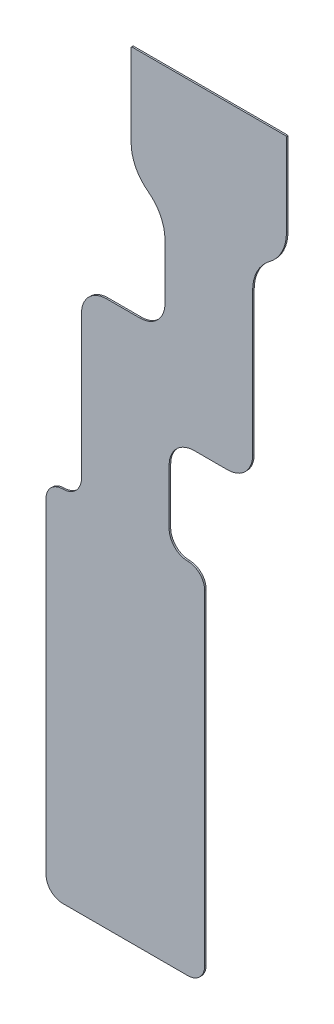
ISO-10303-21;
HEADER;
FILE_DESCRIPTION(('STEP AP214'),'2;1');
FILE_NAME('part.step','',(''),(''),'','','');
FILE_SCHEMA(('AUTOMOTIVE_DESIGN { 1 0 10303 214 1 1 1 1 }'));
ENDSEC;
DATA;
#1=APPLICATION_CONTEXT('core data for automotive mechanical design processes');
#2=APPLICATION_PROTOCOL_DEFINITION('international standard','automotive_design',2000,#1);
#3=PRODUCT_CONTEXT('',#1,'mechanical');
#4=PRODUCT('Part','Part','',(#3));
#5=PRODUCT_RELATED_PRODUCT_CATEGORY('part','',(#4));
#6=PRODUCT_DEFINITION_FORMATION('','',#4);
#7=PRODUCT_DEFINITION_CONTEXT('part definition',#1,'design');
#8=PRODUCT_DEFINITION('design','',#6,#7);
#9=PRODUCT_DEFINITION_SHAPE('','',#8);
#10=(LENGTH_UNIT() NAMED_UNIT(*) SI_UNIT(.MILLI.,.METRE.));
#11=(NAMED_UNIT(*) PLANE_ANGLE_UNIT() SI_UNIT($,.RADIAN.));
#12=(NAMED_UNIT(*) SI_UNIT($,.STERADIAN.) SOLID_ANGLE_UNIT());
#13=UNCERTAINTY_MEASURE_WITH_UNIT(LENGTH_MEASURE(1.E-05),#10,'distance_accuracy_value','');
#14=(GEOMETRIC_REPRESENTATION_CONTEXT(3) GLOBAL_UNCERTAINTY_ASSIGNED_CONTEXT((#13)) GLOBAL_UNIT_ASSIGNED_CONTEXT((#10,
#11,#12)) REPRESENTATION_CONTEXT('',''));
#15=CARTESIAN_POINT('',(0.,0.,0.));
#16=DIRECTION('',(0.,0.,1.));
#17=DIRECTION('',(1.,0.,0.));
#18=AXIS2_PLACEMENT_3D('',#15,#16,#17);
#19=CARTESIAN_POINT('',(13.364756535031,47.837924642411,0.1870075));
#20=DIRECTION('',(0.,0.,-1.));
#21=DIRECTION('',(0.,-1.,0.));
#22=AXIS2_PLACEMENT_3D('',#19,#20,#21);
#23=PLANE('',#22);
#24=DIRECTION('',(-1.,0.,0.));
#25=VECTOR('',#24,1.);
#26=CARTESIAN_POINT('',(17.,0.,0.1870075));
#27=LINE('',#26,#25);
#28=CARTESIAN_POINT('',(17.,0.,0.1870075));
#29=VERTEX_POINT('',#28);
#30=CARTESIAN_POINT('',(2.,0.,0.1870075));
#31=VERTEX_POINT('',#30);
#32=EDGE_CURVE('E27',#29,#31,#27,.T.);
#33=ORIENTED_EDGE('',*,*,#32,.F.);
#34=CARTESIAN_POINT('',(16.999270531401,2.000729468599,0.1870075));
#35=DIRECTION('',(0.,0.,-1.));
#36=DIRECTION('',(0.999999933532946,-0.000364601292675781,0.));
#37=AXIS2_PLACEMENT_3D('',#34,#35,#36);
#38=CIRCLE('',#37,2.000729601582);
#39=CARTESIAN_POINT('',(19.,2.,0.1870075));
#40=VERTEX_POINT('',#39);
#41=EDGE_CURVE('E266',#40,#29,#38,.T.);
#42=ORIENTED_EDGE('',*,*,#41,.F.);
#43=DIRECTION('',(0.,-1.,0.));
#44=VECTOR('',#43,1.);
#45=CARTESIAN_POINT('',(19.,41.,0.1870075));
#46=LINE('',#45,#44);
#47=CARTESIAN_POINT('',(19.,41.,0.1870075));
#48=VERTEX_POINT('',#47);
#49=EDGE_CURVE('E261',#48,#40,#46,.T.);
#50=ORIENTED_EDGE('',*,*,#49,.F.);
#51=CARTESIAN_POINT('',(16.999270531401,40.999270531401,0.1870075));
#52=DIRECTION('',(0.,0.,-1.));
#53=DIRECTION('',(0.000364601292674881,0.999999933532946,0.));
#54=AXIS2_PLACEMENT_3D('',#51,#52,#53);
#55=CIRCLE('',#54,2.000729601582);
#56=CARTESIAN_POINT('',(17.,43.,0.1870075));
#57=VERTEX_POINT('',#56);
#58=EDGE_CURVE('E263',#57,#48,#55,.T.);
#59=ORIENTED_EDGE('',*,*,#58,.F.);
#60=CARTESIAN_POINT('',(16.999966738197,45.249966738197,0.1870075));
#61=DIRECTION('',(0.,0.,1.));
#62=DIRECTION('',(-0.999999999890728,1.4783241907396E-05,0.));
#63=AXIS2_PLACEMENT_3D('',#60,#61,#62);
#64=CIRCLE('',#63,2.249966738443);
#65=CARTESIAN_POINT('',(14.75,45.25,0.1870075));
#66=VERTEX_POINT('',#65);
#67=EDGE_CURVE('E454',#66,#57,#64,.T.);
#68=ORIENTED_EDGE('',*,*,#67,.F.);
#69=DIRECTION('',(0.,-1.,0.));
#70=VECTOR('',#69,1.);
#71=CARTESIAN_POINT('',(14.75,51.856,0.1870075));
#72=LINE('',#71,#70);
#73=CARTESIAN_POINT('',(14.75,51.856,0.1870075));
#74=VERTEX_POINT('',#73);
#75=EDGE_CURVE('E356',#74,#66,#72,.T.);
#76=ORIENTED_EDGE('',*,*,#75,.F.);
#77=CARTESIAN_POINT('',(17.749386564763,51.856613435237,0.1870075));
#78=DIRECTION('',(0.,0.,1.));
#79=DIRECTION('',(0.000204520228138346,0.999999979085738,0.));
#80=AXIS2_PLACEMENT_3D('',#77,#78,#79);
#81=CIRCLE('',#80,2.999386627493);
#82=CARTESIAN_POINT('',(17.75,54.856,0.1870075));
#83=VERTEX_POINT('',#82);
#84=EDGE_CURVE('E582',#83,#74,#81,.T.);
#85=ORIENTED_EDGE('',*,*,#84,.F.);
#86=DIRECTION('',(-1.,0.,0.));
#87=VECTOR('',#86,1.);
#88=CARTESIAN_POINT('',(21.75,54.856,0.1870075));
#89=LINE('',#88,#87);
#90=CARTESIAN_POINT('',(21.75,54.856,0.1870075));
#91=VERTEX_POINT('',#90);
#92=EDGE_CURVE('E569',#91,#83,#89,.T.);
#93=ORIENTED_EDGE('',*,*,#92,.F.);
#94=CARTESIAN_POINT('',(21.748905797101,57.857094202899,0.1870075));
#95=DIRECTION('',(0.,0.,-1.));
#96=DIRECTION('',(0.999999933532946,-0.000364601292676681,0.));
#97=AXIS2_PLACEMENT_3D('',#94,#95,#96);
#98=CIRCLE('',#97,3.001094402372);
#99=CARTESIAN_POINT('',(24.75,57.856,0.1870075));
#100=VERTEX_POINT('',#99);
#101=EDGE_CURVE('E485',#100,#91,#98,.T.);
#102=ORIENTED_EDGE('',*,*,#101,.F.);
#103=DIRECTION('',(0.,-1.,0.));
#104=VECTOR('',#103,1.);
#105=CARTESIAN_POINT('',(24.75,74.963,0.1870075));
#106=LINE('',#105,#104);
#107=CARTESIAN_POINT('',(24.75,74.963,0.1870075));
#108=VERTEX_POINT('',#107);
#109=EDGE_CURVE('E422',#108,#100,#106,.T.);
#110=ORIENTED_EDGE('',*,*,#109,.F.);
#111=CARTESIAN_POINT('',(29.748703202001,74.963025016413,0.1870075));
#112=DIRECTION('',(0.,0.,1.));
#113=DIRECTION('',(-0.594894932104012,0.803803470854016,0.));
#114=AXIS2_PLACEMENT_3D('',#111,#112,#113);
#115=CIRCLE('',#114,4.998703202064);
#116=CARTESIAN_POINT('',(26.775,78.981,0.1870075));
#117=VERTEX_POINT('',#116);
#118=EDGE_CURVE('E397',#117,#108,#115,.T.);
#119=ORIENTED_EDGE('',*,*,#118,.F.);
#120=CARTESIAN_POINT('',(23.797539005272,83.000868503191,0.1870075));
#121=DIRECTION('',(0.,0.,-1.));
#122=DIRECTION('',(0.999999984928884,-0.00017361518234698,0.));
#123=AXIS2_PLACEMENT_3D('',#120,#121,#122);
#124=CIRCLE('',#123,5.002461070121);
#125=CARTESIAN_POINT('',(28.8,83.,0.1870075));
#126=VERTEX_POINT('',#125);
#127=EDGE_CURVE('E377',#126,#117,#124,.T.);
#128=ORIENTED_EDGE('',*,*,#127,.F.);
#129=DIRECTION('',(0.,-1.,0.));
#130=VECTOR('',#129,1.);
#131=CARTESIAN_POINT('',(28.8,92.9,0.1870075));
#132=LINE('',#131,#130);
#133=CARTESIAN_POINT('',(28.8,92.9,0.1870075));
#134=VERTEX_POINT('',#133);
#135=EDGE_CURVE('E532',#134,#126,#132,.T.);
#136=ORIENTED_EDGE('',*,*,#135,.F.);
#137=CARTESIAN_POINT('',(28.700976190476,92.900976190476,0.1870075));
#138=DIRECTION('',(0.,0.,-1.));
#139=DIRECTION('',(-0.00985765998945668,0.999951412089374,0.));
#140=AXIS2_PLACEMENT_3D('',#137,#138,#139);
#141=CIRCLE('',#140,0.09902862111759);
#142=CARTESIAN_POINT('',(28.7,93.,0.1870075));
#143=VERTEX_POINT('',#142);
#144=EDGE_CURVE('E404',#143,#134,#141,.T.);
#145=ORIENTED_EDGE('',*,*,#144,.F.);
#146=DIRECTION('',(1.,0.,0.));
#147=VECTOR('',#146,1.);
#148=CARTESIAN_POINT('',(10.3,93.,0.1870075));
#149=LINE('',#148,#147);
#150=CARTESIAN_POINT('',(10.3,93.,0.1870075));
#151=VERTEX_POINT('',#150);
#152=EDGE_CURVE('E521',#151,#143,#149,.T.);
#153=ORIENTED_EDGE('',*,*,#152,.F.);
#154=CARTESIAN_POINT('',(10.299023809524,92.900976190476,0.1870075));
#155=DIRECTION('',(0.,0.,-1.));
#156=DIRECTION('',(-0.999951412089374,-0.00985765998938469,0.));
#157=AXIS2_PLACEMENT_3D('',#154,#155,#156);
#158=CIRCLE('',#157,0.09902862111759);
#159=CARTESIAN_POINT('',(10.2,92.9,0.1870075));
#160=VERTEX_POINT('',#159);
#161=EDGE_CURVE('E507',#160,#151,#158,.T.);
#162=ORIENTED_EDGE('',*,*,#161,.F.);
#163=DIRECTION('',(0.,1.,0.));
#164=VECTOR('',#163,1.);
#165=CARTESIAN_POINT('',(10.2,83.,0.1870075));
#166=LINE('',#165,#164);
#167=CARTESIAN_POINT('',(10.2,83.,0.1870075));
#168=VERTEX_POINT('',#167);
#169=EDGE_CURVE('E493',#168,#160,#166,.T.);
#170=ORIENTED_EDGE('',*,*,#169,.F.);
#171=CARTESIAN_POINT('',(15.202460994728,83.000868503191,0.1870075));
#172=DIRECTION('',(0.,0.,-1.));
#173=DIRECTION('',(-0.59519923353604,-0.803578168194054,0.));
#174=AXIS2_PLACEMENT_3D('',#171,#172,#173);
#175=CIRCLE('',#174,5.002461070121);
#176=CARTESIAN_POINT('',(12.225,78.981,0.1870075));
#177=VERTEX_POINT('',#176);
#178=EDGE_CURVE('E478',#177,#168,#175,.T.);
#179=ORIENTED_EDGE('',*,*,#178,.F.);
#180=CARTESIAN_POINT('',(9.251296797999,74.963025016413,0.1870075));
#181=DIRECTION('',(0.,0.,1.));
#182=DIRECTION('',(0.999999999987477,-5.00458059835339E-06,0.));
#183=AXIS2_PLACEMENT_3D('',#180,#181,#182);
#184=CIRCLE('',#183,4.998703202064);
#185=CARTESIAN_POINT('',(14.25,74.963,0.1870075));
#186=VERTEX_POINT('',#185);
#187=EDGE_CURVE('E420',#186,#177,#184,.T.);
#188=ORIENTED_EDGE('',*,*,#187,.F.);
#189=DIRECTION('',(0.,1.,0.));
#190=VECTOR('',#189,1.);
#191=CARTESIAN_POINT('',(14.25,68.356,0.1870075));
#192=LINE('',#191,#190);
#193=CARTESIAN_POINT('',(14.25,68.356,0.1870075));
#194=VERTEX_POINT('',#193);
#195=EDGE_CURVE('E452',#194,#186,#192,.T.);
#196=ORIENTED_EDGE('',*,*,#195,.F.);
#197=CARTESIAN_POINT('',(11.248905797101,68.357094202899,0.1870075));
#198=DIRECTION('',(0.,0.,1.));
#199=DIRECTION('',(0.000364601292678981,-0.999999933532946,0.));
#200=AXIS2_PLACEMENT_3D('',#197,#198,#199);
#201=CIRCLE('',#200,3.001094402372);
#202=CARTESIAN_POINT('',(11.25,65.356,0.1870075));
#203=VERTEX_POINT('',#202);
#204=EDGE_CURVE('E445',#203,#194,#201,.T.);
#205=ORIENTED_EDGE('',*,*,#204,.F.);
#206=DIRECTION('',(1.,0.,0.));
#207=VECTOR('',#206,1.);
#208=CARTESIAN_POINT('',(7.25,65.356,0.1870075));
#209=LINE('',#208,#207);
#210=CARTESIAN_POINT('',(7.25,65.356,0.1870075));
#211=VERTEX_POINT('',#210);
#212=EDGE_CURVE('E412',#211,#203,#209,.T.);
#213=ORIENTED_EDGE('',*,*,#212,.F.);
#214=CARTESIAN_POINT('',(7.249386564763,62.356613435237,0.1870075));
#215=DIRECTION('',(0.,0.,-1.));
#216=DIRECTION('',(-0.999999979085738,-0.000204520228137146,0.));
#217=AXIS2_PLACEMENT_3D('',#214,#215,#216);
#218=CIRCLE('',#217,2.999386627493);
#219=CARTESIAN_POINT('',(4.25,62.356,0.1870075));
#220=VERTEX_POINT('',#219);
#221=EDGE_CURVE('E369',#220,#211,#218,.T.);
#222=ORIENTED_EDGE('',*,*,#221,.F.);
#223=DIRECTION('',(0.,1.,0.));
#224=VECTOR('',#223,1.);
#225=CARTESIAN_POINT('',(4.25,45.25,0.1870075));
#226=LINE('',#225,#224);
#227=CARTESIAN_POINT('',(4.25,45.25,0.1870075));
#228=VERTEX_POINT('',#227);
#229=EDGE_CURVE('E337',#228,#220,#226,.T.);
#230=ORIENTED_EDGE('',*,*,#229,.F.);
#231=CARTESIAN_POINT('',(2.000033261803,45.249966738197,0.1870075));
#232=DIRECTION('',(0.,0.,1.));
#233=DIRECTION('',(-1.4783241907006E-05,-0.999999999890728,0.));
#234=AXIS2_PLACEMENT_3D('',#231,#232,#233);
#235=CIRCLE('',#234,2.249966738443);
#236=CARTESIAN_POINT('',(2.,43.,0.1870075));
#237=VERTEX_POINT('',#236);
#238=EDGE_CURVE('E367',#237,#228,#235,.T.);
#239=ORIENTED_EDGE('',*,*,#238,.F.);
#240=CARTESIAN_POINT('',(2.000729468599,40.999270531401,0.1870075));
#241=DIRECTION('',(0.,0.,-1.));
#242=DIRECTION('',(-0.999999933532946,0.000364601292676681,0.));
#243=AXIS2_PLACEMENT_3D('',#240,#241,#242);
#244=CIRCLE('',#243,2.000729601582);
#245=CARTESIAN_POINT('',(0.,41.,0.1870075));
#246=VERTEX_POINT('',#245);
#247=EDGE_CURVE('E351',#246,#237,#244,.T.);
#248=ORIENTED_EDGE('',*,*,#247,.F.);
#249=DIRECTION('',(0.,1.,0.));
#250=VECTOR('',#249,1.);
#251=CARTESIAN_POINT('',(0.,2.,0.1870075));
#252=LINE('',#251,#250);
#253=CARTESIAN_POINT('',(0.,2.,0.1870075));
#254=VERTEX_POINT('',#253);
#255=EDGE_CURVE('E312',#254,#246,#252,.T.);
#256=ORIENTED_EDGE('',*,*,#255,.F.);
#257=CARTESIAN_POINT('',(2.000729468599,2.000729468599,0.1870075));
#258=DIRECTION('',(0.,0.,-1.));
#259=DIRECTION('',(-0.000364601292677081,-0.999999933532946,0.));
#260=AXIS2_PLACEMENT_3D('',#257,#258,#259);
#261=CIRCLE('',#260,2.000729601582);
#262=EDGE_CURVE('E311',#31,#254,#261,.T.);
#263=ORIENTED_EDGE('',*,*,#262,.F.);
#264=EDGE_LOOP('',(#33,#42,#50,#59,#68,#76,#85,#93,#102,#110,#119,#128,#136,#145,#153,#162,#170,
#179,#188,#196,#205,#213,#222,#230,#239,#248,#256,#263));
#265=FACE_BOUND('',#264,.T.);
#266=ADVANCED_FACE('F17',(#265),#23,.F.);
#267=CARTESIAN_POINT('',(13.364756535031,47.837924642411,0.));
#268=DIRECTION('',(0.,0.,-1.));
#269=DIRECTION('',(0.,-1.,0.));
#270=AXIS2_PLACEMENT_3D('',#267,#268,#269);
#271=PLANE('',#270);
#272=CARTESIAN_POINT('',(2.000729468599,2.000729468599,0.));
#273=DIRECTION('',(0.,0.,-1.));
#274=DIRECTION('',(-0.000364601292677081,-0.999999933532946,0.));
#275=AXIS2_PLACEMENT_3D('',#272,#273,#274);
#276=CIRCLE('',#275,2.000729601582);
#277=CARTESIAN_POINT('',(2.,0.,0.));
#278=VERTEX_POINT('',#277);
#279=CARTESIAN_POINT('',(0.,2.,0.));
#280=VERTEX_POINT('',#279);
#281=EDGE_CURVE('E324',#278,#280,#276,.T.);
#282=ORIENTED_EDGE('',*,*,#281,.T.);
#283=DIRECTION('',(0.,1.,0.));
#284=VECTOR('',#283,1.);
#285=CARTESIAN_POINT('',(0.,2.,0.));
#286=LINE('',#285,#284);
#287=CARTESIAN_POINT('',(0.,41.,0.));
#288=VERTEX_POINT('',#287);
#289=EDGE_CURVE('E346',#280,#288,#286,.T.);
#290=ORIENTED_EDGE('',*,*,#289,.T.);
#291=CARTESIAN_POINT('',(2.000729468599,40.999270531401,0.));
#292=DIRECTION('',(0.,0.,-1.));
#293=DIRECTION('',(-0.999999933532946,0.000364601292676681,0.));
#294=AXIS2_PLACEMENT_3D('',#291,#292,#293);
#295=CIRCLE('',#294,2.000729601582);
#296=CARTESIAN_POINT('',(2.,43.,0.));
#297=VERTEX_POINT('',#296);
#298=EDGE_CURVE('E364',#288,#297,#295,.T.);
#299=ORIENTED_EDGE('',*,*,#298,.T.);
#300=CARTESIAN_POINT('',(2.000033261803,45.249966738197,0.));
#301=DIRECTION('',(0.,0.,1.));
#302=DIRECTION('',(-1.4783241907006E-05,-0.999999999890728,0.));
#303=AXIS2_PLACEMENT_3D('',#300,#301,#302);
#304=CIRCLE('',#303,2.249966738443);
#305=CARTESIAN_POINT('',(4.25,45.25,0.));
#306=VERTEX_POINT('',#305);
#307=EDGE_CURVE('E383',#297,#306,#304,.T.);
#308=ORIENTED_EDGE('',*,*,#307,.T.);
#309=DIRECTION('',(0.,1.,0.));
#310=VECTOR('',#309,1.);
#311=CARTESIAN_POINT('',(4.25,45.25,0.));
#312=LINE('',#311,#310);
#313=CARTESIAN_POINT('',(4.25,62.356,0.));
#314=VERTEX_POINT('',#313);
#315=EDGE_CURVE('E336',#306,#314,#312,.T.);
#316=ORIENTED_EDGE('',*,*,#315,.T.);
#317=CARTESIAN_POINT('',(7.249386564763,62.356613435237,0.));
#318=DIRECTION('',(0.,0.,-1.));
#319=DIRECTION('',(-0.999999979085738,-0.000204520228137146,0.));
#320=AXIS2_PLACEMENT_3D('',#317,#318,#319);
#321=CIRCLE('',#320,2.999386627493);
#322=CARTESIAN_POINT('',(7.25,65.356,0.));
#323=VERTEX_POINT('',#322);
#324=EDGE_CURVE('E402',#314,#323,#321,.T.);
#325=ORIENTED_EDGE('',*,*,#324,.T.);
#326=DIRECTION('',(1.,0.,0.));
#327=VECTOR('',#326,1.);
#328=CARTESIAN_POINT('',(7.25,65.356,0.));
#329=LINE('',#328,#327);
#330=CARTESIAN_POINT('',(11.25,65.356,0.));
#331=VERTEX_POINT('',#330);
#332=EDGE_CURVE('E437',#323,#331,#329,.T.);
#333=ORIENTED_EDGE('',*,*,#332,.T.);
#334=CARTESIAN_POINT('',(11.248905797101,68.357094202899,0.));
#335=DIRECTION('',(0.,0.,1.));
#336=DIRECTION('',(0.000364601292678981,-0.999999933532946,0.));
#337=AXIS2_PLACEMENT_3D('',#334,#335,#336);
#338=CIRCLE('',#337,3.001094402372);
#339=CARTESIAN_POINT('',(14.25,68.356,0.));
#340=VERTEX_POINT('',#339);
#341=EDGE_CURVE('E450',#331,#340,#338,.T.);
#342=ORIENTED_EDGE('',*,*,#341,.T.);
#343=DIRECTION('',(0.,1.,0.));
#344=VECTOR('',#343,1.);
#345=CARTESIAN_POINT('',(14.25,68.356,0.));
#346=LINE('',#345,#344);
#347=CARTESIAN_POINT('',(14.25,74.963,0.));
#348=VERTEX_POINT('',#347);
#349=EDGE_CURVE('E414',#340,#348,#346,.T.);
#350=ORIENTED_EDGE('',*,*,#349,.T.);
#351=CARTESIAN_POINT('',(9.251296797999,74.963025016413,0.));
#352=DIRECTION('',(0.,0.,1.));
#353=DIRECTION('',(0.999999999987477,-5.00458059835339E-06,0.));
#354=AXIS2_PLACEMENT_3D('',#351,#352,#353);
#355=CIRCLE('',#354,4.998703202064);
#356=CARTESIAN_POINT('',(12.225,78.981,0.));
#357=VERTEX_POINT('',#356);
#358=EDGE_CURVE('E472',#348,#357,#355,.T.);
#359=ORIENTED_EDGE('',*,*,#358,.T.);
#360=CARTESIAN_POINT('',(15.202460994728,83.000868503191,0.));
#361=DIRECTION('',(0.,0.,-1.));
#362=DIRECTION('',(-0.59519923353604,-0.803578168194054,0.));
#363=AXIS2_PLACEMENT_3D('',#360,#361,#362);
#364=CIRCLE('',#363,5.002461070121);
#365=CARTESIAN_POINT('',(10.2,83.,0.));
#366=VERTEX_POINT('',#365);
#367=EDGE_CURVE('E489',#357,#366,#364,.T.);
#368=ORIENTED_EDGE('',*,*,#367,.T.);
#369=DIRECTION('',(0.,1.,0.));
#370=VECTOR('',#369,1.);
#371=CARTESIAN_POINT('',(10.2,83.,0.));
#372=LINE('',#371,#370);
#373=CARTESIAN_POINT('',(10.2,92.9,0.));
#374=VERTEX_POINT('',#373);
#375=EDGE_CURVE('E502',#366,#374,#372,.T.);
#376=ORIENTED_EDGE('',*,*,#375,.T.);
#377=CARTESIAN_POINT('',(10.299023809524,92.900976190476,0.));
#378=DIRECTION('',(0.,0.,-1.));
#379=DIRECTION('',(-0.999951412089374,-0.00985765998938469,0.));
#380=AXIS2_PLACEMENT_3D('',#377,#378,#379);
#381=CIRCLE('',#380,0.09902862111759);
#382=CARTESIAN_POINT('',(10.3,93.,0.));
#383=VERTEX_POINT('',#382);
#384=EDGE_CURVE('E520',#374,#383,#381,.T.);
#385=ORIENTED_EDGE('',*,*,#384,.T.);
#386=DIRECTION('',(1.,0.,0.));
#387=VECTOR('',#386,1.);
#388=CARTESIAN_POINT('',(10.3,93.,0.));
#389=LINE('',#388,#387);
#390=CARTESIAN_POINT('',(28.7,93.,0.));
#391=VERTEX_POINT('',#390);
#392=EDGE_CURVE('E409',#383,#391,#389,.T.);
#393=ORIENTED_EDGE('',*,*,#392,.T.);
#394=CARTESIAN_POINT('',(28.700976190476,92.900976190476,0.));
#395=DIRECTION('',(0.,0.,-1.));
#396=DIRECTION('',(-0.00985765998945668,0.999951412089374,0.));
#397=AXIS2_PLACEMENT_3D('',#394,#395,#396);
#398=CIRCLE('',#397,0.09902862111759);
#399=CARTESIAN_POINT('',(28.8,92.9,0.));
#400=VERTEX_POINT('',#399);
#401=EDGE_CURVE('E432',#391,#400,#398,.T.);
#402=ORIENTED_EDGE('',*,*,#401,.T.);
#403=DIRECTION('',(0.,-1.,0.));
#404=VECTOR('',#403,1.);
#405=CARTESIAN_POINT('',(28.8,92.9,0.));
#406=LINE('',#405,#404);
#407=CARTESIAN_POINT('',(28.8,83.,0.));
#408=VERTEX_POINT('',#407);
#409=EDGE_CURVE('E374',#400,#408,#406,.T.);
#410=ORIENTED_EDGE('',*,*,#409,.T.);
#411=CARTESIAN_POINT('',(23.797539005272,83.000868503191,0.));
#412=DIRECTION('',(0.,0.,-1.));
#413=DIRECTION('',(0.999999984928884,-0.00017361518234698,0.));
#414=AXIS2_PLACEMENT_3D('',#411,#412,#413);
#415=CIRCLE('',#414,5.002461070121);
#416=CARTESIAN_POINT('',(26.775,78.981,0.));
#417=VERTEX_POINT('',#416);
#418=EDGE_CURVE('E395',#408,#417,#415,.T.);
#419=ORIENTED_EDGE('',*,*,#418,.T.);
#420=CARTESIAN_POINT('',(29.748703202001,74.963025016413,0.));
#421=DIRECTION('',(0.,0.,1.));
#422=DIRECTION('',(-0.594894932104012,0.803803470854016,0.));
#423=AXIS2_PLACEMENT_3D('',#420,#421,#422);
#424=CIRCLE('',#423,4.998703202064);
#425=CARTESIAN_POINT('',(24.75,74.963,0.));
#426=VERTEX_POINT('',#425);
#427=EDGE_CURVE('E429',#417,#426,#424,.T.);
#428=ORIENTED_EDGE('',*,*,#427,.T.);
#429=DIRECTION('',(0.,-1.,0.));
#430=VECTOR('',#429,1.);
#431=CARTESIAN_POINT('',(24.75,74.963,0.));
#432=LINE('',#431,#430);
#433=CARTESIAN_POINT('',(24.75,57.856,0.));
#434=VERTEX_POINT('',#433);
#435=EDGE_CURVE('E560',#426,#434,#432,.T.);
#436=ORIENTED_EDGE('',*,*,#435,.T.);
#437=CARTESIAN_POINT('',(21.748905797101,57.857094202899,0.));
#438=DIRECTION('',(0.,0.,-1.));
#439=DIRECTION('',(0.999999933532946,-0.000364601292676681,0.));
#440=AXIS2_PLACEMENT_3D('',#437,#438,#439);
#441=CIRCLE('',#440,3.001094402372);
#442=CARTESIAN_POINT('',(21.75,54.856,0.));
#443=VERTEX_POINT('',#442);
#444=EDGE_CURVE('E481',#434,#443,#441,.T.);
#445=ORIENTED_EDGE('',*,*,#444,.T.);
#446=DIRECTION('',(-1.,0.,0.));
#447=VECTOR('',#446,1.);
#448=CARTESIAN_POINT('',(21.75,54.856,0.));
#449=LINE('',#448,#447);
#450=CARTESIAN_POINT('',(17.75,54.856,0.));
#451=VERTEX_POINT('',#450);
#452=EDGE_CURVE('E578',#443,#451,#449,.T.);
#453=ORIENTED_EDGE('',*,*,#452,.T.);
#454=CARTESIAN_POINT('',(17.749386564763,51.856613435237,0.));
#455=DIRECTION('',(0.,0.,1.));
#456=DIRECTION('',(0.000204520228138346,0.999999979085738,0.));
#457=AXIS2_PLACEMENT_3D('',#454,#455,#456);
#458=CIRCLE('',#457,2.999386627493);
#459=CARTESIAN_POINT('',(14.75,51.856,0.));
#460=VERTEX_POINT('',#459);
#461=EDGE_CURVE('E363',#451,#460,#458,.T.);
#462=ORIENTED_EDGE('',*,*,#461,.T.);
#463=DIRECTION('',(0.,-1.,0.));
#464=VECTOR('',#463,1.);
#465=CARTESIAN_POINT('',(14.75,51.856,0.));
#466=LINE('',#465,#464);
#467=CARTESIAN_POINT('',(14.75,45.25,0.));
#468=VERTEX_POINT('',#467);
#469=EDGE_CURVE('E458',#460,#468,#466,.T.);
#470=ORIENTED_EDGE('',*,*,#469,.T.);
#471=CARTESIAN_POINT('',(16.999966738197,45.249966738197,0.));
#472=DIRECTION('',(0.,0.,1.));
#473=DIRECTION('',(-0.999999999890728,1.4783241907396E-05,0.));
#474=AXIS2_PLACEMENT_3D('',#471,#472,#473);
#475=CIRCLE('',#474,2.249966738443);
#476=CARTESIAN_POINT('',(17.,43.,0.));
#477=VERTEX_POINT('',#476);
#478=EDGE_CURVE('E284',#468,#477,#475,.T.);
#479=ORIENTED_EDGE('',*,*,#478,.T.);
#480=CARTESIAN_POINT('',(16.999270531401,40.999270531401,0.));
#481=DIRECTION('',(0.,0.,-1.));
#482=DIRECTION('',(0.000364601292674881,0.999999933532946,0.));
#483=AXIS2_PLACEMENT_3D('',#480,#481,#482);
#484=CIRCLE('',#483,2.000729601582);
#485=CARTESIAN_POINT('',(19.,41.,0.));
#486=VERTEX_POINT('',#485);
#487=EDGE_CURVE('E269',#477,#486,#484,.T.);
#488=ORIENTED_EDGE('',*,*,#487,.T.);
#489=DIRECTION('',(0.,-1.,0.));
#490=VECTOR('',#489,1.);
#491=CARTESIAN_POINT('',(19.,41.,0.));
#492=LINE('',#491,#490);
#493=CARTESIAN_POINT('',(19.,2.,0.));
#494=VERTEX_POINT('',#493);
#495=EDGE_CURVE('E251',#486,#494,#492,.T.);
#496=ORIENTED_EDGE('',*,*,#495,.T.);
#497=CARTESIAN_POINT('',(16.999270531401,2.000729468599,0.));
#498=DIRECTION('',(0.,0.,-1.));
#499=DIRECTION('',(0.999999933532946,-0.000364601292675781,0.));
#500=AXIS2_PLACEMENT_3D('',#497,#498,#499);
#501=CIRCLE('',#500,2.000729601582);
#502=CARTESIAN_POINT('',(17.,0.,0.));
#503=VERTEX_POINT('',#502);
#504=EDGE_CURVE('E305',#494,#503,#501,.T.);
#505=ORIENTED_EDGE('',*,*,#504,.T.);
#506=DIRECTION('',(-1.,0.,0.));
#507=VECTOR('',#506,1.);
#508=CARTESIAN_POINT('',(17.,0.,0.));
#509=LINE('',#508,#507);
#510=EDGE_CURVE('E11',#503,#278,#509,.T.);
#511=ORIENTED_EDGE('',*,*,#510,.T.);
#512=EDGE_LOOP('',(#282,#290,#299,#308,#316,#325,#333,#342,#350,#359,#368,#376,#385,#393,#402,
#410,#419,#428,#436,#445,#453,#462,#470,#479,#488,#496,#505,#511));
#513=FACE_BOUND('',#512,.T.);
#514=ADVANCED_FACE('F827',(#513),#271,.T.);
#515=CARTESIAN_POINT('',(17.,0.,0.));
#516=DIRECTION('',(0.,-1.,0.));
#517=DIRECTION('',(0.,0.,-1.));
#518=AXIS2_PLACEMENT_3D('',#515,#516,#517);
#519=PLANE('',#518);
#520=DIRECTION('',(0.,0.,1.));
#521=VECTOR('',#520,1.);
#522=CARTESIAN_POINT('',(17.,0.,0.));
#523=LINE('',#522,#521);
#524=EDGE_CURVE('E301',#503,#29,#523,.T.);
#525=ORIENTED_EDGE('',*,*,#524,.T.);
#526=ORIENTED_EDGE('',*,*,#32,.T.);
#527=DIRECTION('',(0.,0.,1.));
#528=VECTOR('',#527,1.);
#529=CARTESIAN_POINT('',(2.,0.,0.));
#530=LINE('',#529,#528);
#531=EDGE_CURVE('E309',#278,#31,#530,.T.);
#532=ORIENTED_EDGE('',*,*,#531,.F.);
#533=ORIENTED_EDGE('',*,*,#510,.F.);
#534=EDGE_LOOP('',(#525,#526,#532,#533));
#535=FACE_BOUND('',#534,.T.);
#536=ADVANCED_FACE('F306',(#535),#519,.T.);
#537=CARTESIAN_POINT('',(16.999270531401,2.000729468599,0.));
#538=DIRECTION('',(0.,0.,-1.));
#539=DIRECTION('',(0.999999933532946,-0.000364601292675781,0.));
#540=AXIS2_PLACEMENT_3D('',#537,#538,#539);
#541=CYLINDRICAL_SURFACE('',#540,2.000729601582);
#542=DIRECTION('',(0.,0.,1.));
#543=VECTOR('',#542,1.);
#544=CARTESIAN_POINT('',(19.,2.,0.));
#545=LINE('',#544,#543);
#546=EDGE_CURVE('E267',#494,#40,#545,.T.);
#547=ORIENTED_EDGE('',*,*,#546,.T.);
#548=ORIENTED_EDGE('',*,*,#41,.T.);
#549=ORIENTED_EDGE('',*,*,#524,.F.);
#550=ORIENTED_EDGE('',*,*,#504,.F.);
#551=EDGE_LOOP('',(#547,#548,#549,#550));
#552=FACE_BOUND('',#551,.T.);
#553=ADVANCED_FACE('F826',(#552),#541,.T.);
#554=CARTESIAN_POINT('',(19.,41.,0.));
#555=DIRECTION('',(1.,0.,0.));
#556=DIRECTION('',(0.,1.,0.));
#557=AXIS2_PLACEMENT_3D('',#554,#555,#556);
#558=PLANE('',#557);
#559=DIRECTION('',(0.,0.,1.));
#560=VECTOR('',#559,1.);
#561=CARTESIAN_POINT('',(19.,41.,0.));
#562=LINE('',#561,#560);
#563=EDGE_CURVE('E272',#486,#48,#562,.T.);
#564=ORIENTED_EDGE('',*,*,#563,.T.);
#565=ORIENTED_EDGE('',*,*,#49,.T.);
#566=ORIENTED_EDGE('',*,*,#546,.F.);
#567=ORIENTED_EDGE('',*,*,#495,.F.);
#568=EDGE_LOOP('',(#564,#565,#566,#567));
#569=FACE_BOUND('',#568,.T.);
#570=ADVANCED_FACE('F273',(#569),#558,.T.);
#571=CARTESIAN_POINT('',(16.999270531401,40.999270531401,0.));
#572=DIRECTION('',(0.,0.,-1.));
#573=DIRECTION('',(0.000364601292674881,0.999999933532946,0.));
#574=AXIS2_PLACEMENT_3D('',#571,#572,#573);
#575=CYLINDRICAL_SURFACE('',#574,2.000729601582);
#576=DIRECTION('',(0.,0.,1.));
#577=VECTOR('',#576,1.);
#578=CARTESIAN_POINT('',(17.,43.,0.));
#579=LINE('',#578,#577);
#580=EDGE_CURVE('E278',#477,#57,#579,.T.);
#581=ORIENTED_EDGE('',*,*,#580,.T.);
#582=ORIENTED_EDGE('',*,*,#58,.T.);
#583=ORIENTED_EDGE('',*,*,#563,.F.);
#584=ORIENTED_EDGE('',*,*,#487,.F.);
#585=EDGE_LOOP('',(#581,#582,#583,#584));
#586=FACE_BOUND('',#585,.T.);
#587=ADVANCED_FACE('F279',(#586),#575,.T.);
#588=CARTESIAN_POINT('',(16.999966738197,45.249966738197,0.));
#589=DIRECTION('',(0.,0.,-1.));
#590=DIRECTION('',(-0.999999999890728,1.4783241907396E-05,0.));
#591=AXIS2_PLACEMENT_3D('',#588,#589,#590);
#592=CYLINDRICAL_SURFACE('',#591,2.249966738443);
#593=DIRECTION('',(0.,0.,1.));
#594=VECTOR('',#593,1.);
#595=CARTESIAN_POINT('',(14.75,45.25,0.));
#596=LINE('',#595,#594);
#597=EDGE_CURVE('E359',#468,#66,#596,.T.);
#598=ORIENTED_EDGE('',*,*,#597,.T.);
#599=ORIENTED_EDGE('',*,*,#67,.T.);
#600=ORIENTED_EDGE('',*,*,#580,.F.);
#601=ORIENTED_EDGE('',*,*,#478,.F.);
#602=EDGE_LOOP('',(#598,#599,#600,#601));
#603=FACE_BOUND('',#602,.T.);
#604=ADVANCED_FACE('F929',(#603),#592,.F.);
#605=CARTESIAN_POINT('',(14.75,51.856,0.));
#606=DIRECTION('',(1.,0.,0.));
#607=DIRECTION('',(0.,1.,0.));
#608=AXIS2_PLACEMENT_3D('',#605,#606,#607);
#609=PLANE('',#608);
#610=DIRECTION('',(0.,0.,1.));
#611=VECTOR('',#610,1.);
#612=CARTESIAN_POINT('',(14.75,51.856,0.));
#613=LINE('',#612,#611);
#614=EDGE_CURVE('E588',#460,#74,#613,.T.);
#615=ORIENTED_EDGE('',*,*,#614,.T.);
#616=ORIENTED_EDGE('',*,*,#75,.T.);
#617=ORIENTED_EDGE('',*,*,#597,.F.);
#618=ORIENTED_EDGE('',*,*,#469,.F.);
#619=EDGE_LOOP('',(#615,#616,#617,#618));
#620=FACE_BOUND('',#619,.T.);
#621=ADVANCED_FACE('F938',(#620),#609,.T.);
#622=CARTESIAN_POINT('',(17.749386564763,51.856613435237,0.));
#623=DIRECTION('',(0.,0.,-1.));
#624=DIRECTION('',(0.000204520228138346,0.999999979085738,0.));
#625=AXIS2_PLACEMENT_3D('',#622,#623,#624);
#626=CYLINDRICAL_SURFACE('',#625,2.999386627493);
#627=DIRECTION('',(0.,0.,1.));
#628=VECTOR('',#627,1.);
#629=CARTESIAN_POINT('',(17.75,54.856,0.));
#630=LINE('',#629,#628);
#631=EDGE_CURVE('E573',#451,#83,#630,.T.);
#632=ORIENTED_EDGE('',*,*,#631,.T.);
#633=ORIENTED_EDGE('',*,*,#84,.T.);
#634=ORIENTED_EDGE('',*,*,#614,.F.);
#635=ORIENTED_EDGE('',*,*,#461,.F.);
#636=EDGE_LOOP('',(#632,#633,#634,#635));
#637=FACE_BOUND('',#636,.T.);
#638=ADVANCED_FACE('F955',(#637),#626,.F.);
#639=CARTESIAN_POINT('',(21.75,54.856,0.));
#640=DIRECTION('',(0.,-1.,0.));
#641=DIRECTION('',(0.,0.,-1.));
#642=AXIS2_PLACEMENT_3D('',#639,#640,#641);
#643=PLANE('',#642);
#644=DIRECTION('',(0.,0.,1.));
#645=VECTOR('',#644,1.);
#646=CARTESIAN_POINT('',(21.75,54.856,0.));
#647=LINE('',#646,#645);
#648=EDGE_CURVE('E480',#443,#91,#647,.T.);
#649=ORIENTED_EDGE('',*,*,#648,.T.);
#650=ORIENTED_EDGE('',*,*,#92,.T.);
#651=ORIENTED_EDGE('',*,*,#631,.F.);
#652=ORIENTED_EDGE('',*,*,#452,.F.);
#653=EDGE_LOOP('',(#649,#650,#651,#652));
#654=FACE_BOUND('',#653,.T.);
#655=ADVANCED_FACE('F965',(#654),#643,.T.);
#656=CARTESIAN_POINT('',(21.748905797101,57.857094202899,0.));
#657=DIRECTION('',(0.,0.,-1.));
#658=DIRECTION('',(0.999999933532946,-0.000364601292676681,0.));
#659=AXIS2_PLACEMENT_3D('',#656,#657,#658);
#660=CYLINDRICAL_SURFACE('',#659,3.001094402372);
#661=DIRECTION('',(0.,0.,1.));
#662=VECTOR('',#661,1.);
#663=CARTESIAN_POINT('',(24.75,57.856,0.));
#664=LINE('',#663,#662);
#665=EDGE_CURVE('E427',#434,#100,#664,.T.);
#666=ORIENTED_EDGE('',*,*,#665,.T.);
#667=ORIENTED_EDGE('',*,*,#101,.T.);
#668=ORIENTED_EDGE('',*,*,#648,.F.);
#669=ORIENTED_EDGE('',*,*,#444,.F.);
#670=EDGE_LOOP('',(#666,#667,#668,#669));
#671=FACE_BOUND('',#670,.T.);
#672=ADVANCED_FACE('F971',(#671),#660,.T.);
#673=CARTESIAN_POINT('',(24.75,74.963,0.));
#674=DIRECTION('',(1.,0.,0.));
#675=DIRECTION('',(0.,1.,0.));
#676=AXIS2_PLACEMENT_3D('',#673,#674,#675);
#677=PLANE('',#676);
#678=DIRECTION('',(0.,0.,1.));
#679=VECTOR('',#678,1.);
#680=CARTESIAN_POINT('',(24.75,74.963,0.));
#681=LINE('',#680,#679);
#682=EDGE_CURVE('E549',#426,#108,#681,.T.);
#683=ORIENTED_EDGE('',*,*,#682,.T.);
#684=ORIENTED_EDGE('',*,*,#109,.T.);
#685=ORIENTED_EDGE('',*,*,#665,.F.);
#686=ORIENTED_EDGE('',*,*,#435,.F.);
#687=EDGE_LOOP('',(#683,#684,#685,#686));
#688=FACE_BOUND('',#687,.T.);
#689=ADVANCED_FACE('F982',(#688),#677,.T.);
#690=CARTESIAN_POINT('',(29.748703202001,74.963025016413,0.));
#691=DIRECTION('',(0.,0.,-1.));
#692=DIRECTION('',(-0.594894932104012,0.803803470854016,0.));
#693=AXIS2_PLACEMENT_3D('',#690,#691,#692);
#694=CYLINDRICAL_SURFACE('',#693,4.998703202064);
#695=DIRECTION('',(0.,0.,1.));
#696=VECTOR('',#695,1.);
#697=CARTESIAN_POINT('',(26.775,78.981,0.));
#698=LINE('',#697,#696);
#699=EDGE_CURVE('E399',#417,#117,#698,.T.);
#700=ORIENTED_EDGE('',*,*,#699,.T.);
#701=ORIENTED_EDGE('',*,*,#118,.T.);
#702=ORIENTED_EDGE('',*,*,#682,.F.);
#703=ORIENTED_EDGE('',*,*,#427,.F.);
#704=EDGE_LOOP('',(#700,#701,#702,#703));
#705=FACE_BOUND('',#704,.T.);
#706=ADVANCED_FACE('F993',(#705),#694,.F.);
#707=CARTESIAN_POINT('',(23.797539005272,83.000868503191,0.));
#708=DIRECTION('',(0.,0.,-1.));
#709=DIRECTION('',(0.999999984928884,-0.00017361518234698,0.));
#710=AXIS2_PLACEMENT_3D('',#707,#708,#709);
#711=CYLINDRICAL_SURFACE('',#710,5.002461070121);
#712=DIRECTION('',(0.,0.,1.));
#713=VECTOR('',#712,1.);
#714=CARTESIAN_POINT('',(28.8,83.,0.));
#715=LINE('',#714,#713);
#716=EDGE_CURVE('E379',#408,#126,#715,.T.);
#717=ORIENTED_EDGE('',*,*,#716,.T.);
#718=ORIENTED_EDGE('',*,*,#127,.T.);
#719=ORIENTED_EDGE('',*,*,#699,.F.);
#720=ORIENTED_EDGE('',*,*,#418,.F.);
#721=EDGE_LOOP('',(#717,#718,#719,#720));
#722=FACE_BOUND('',#721,.T.);
#723=ADVANCED_FACE('F1010',(#722),#711,.T.);
#724=CARTESIAN_POINT('',(28.8,92.9,0.));
#725=DIRECTION('',(1.,0.,0.));
#726=DIRECTION('',(0.,1.,0.));
#727=AXIS2_PLACEMENT_3D('',#724,#725,#726);
#728=PLANE('',#727);
#729=DIRECTION('',(0.,0.,1.));
#730=VECTOR('',#729,1.);
#731=CARTESIAN_POINT('',(28.8,92.9,0.));
#732=LINE('',#731,#730);
#733=EDGE_CURVE('E408',#400,#134,#732,.T.);
#734=ORIENTED_EDGE('',*,*,#733,.T.);
#735=ORIENTED_EDGE('',*,*,#135,.T.);
#736=ORIENTED_EDGE('',*,*,#716,.F.);
#737=ORIENTED_EDGE('',*,*,#409,.F.);
#738=EDGE_LOOP('',(#734,#735,#736,#737));
#739=FACE_BOUND('',#738,.T.);
#740=ADVANCED_FACE('F1020',(#739),#728,.T.);
#741=CARTESIAN_POINT('',(28.700976190476,92.900976190476,0.));
#742=DIRECTION('',(0.,0.,-1.));
#743=DIRECTION('',(-0.00985765998945668,0.999951412089374,0.));
#744=AXIS2_PLACEMENT_3D('',#741,#742,#743);
#745=CYLINDRICAL_SURFACE('',#744,0.09902862111759);
#746=DIRECTION('',(0.,0.,1.));
#747=VECTOR('',#746,1.);
#748=CARTESIAN_POINT('',(28.7,93.,0.));
#749=LINE('',#748,#747);
#750=EDGE_CURVE('E524',#391,#143,#749,.T.);
#751=ORIENTED_EDGE('',*,*,#750,.T.);
#752=ORIENTED_EDGE('',*,*,#144,.T.);
#753=ORIENTED_EDGE('',*,*,#733,.F.);
#754=ORIENTED_EDGE('',*,*,#401,.F.);
#755=EDGE_LOOP('',(#751,#752,#753,#754));
#756=FACE_BOUND('',#755,.T.);
#757=ADVANCED_FACE('F1026',(#756),#745,.T.);
#758=CARTESIAN_POINT('',(10.3,93.,0.));
#759=DIRECTION('',(0.,1.,0.));
#760=DIRECTION('',(1.,0.,0.));
#761=AXIS2_PLACEMENT_3D('',#758,#759,#760);
#762=PLANE('',#761);
#763=DIRECTION('',(0.,0.,1.));
#764=VECTOR('',#763,1.);
#765=CARTESIAN_POINT('',(10.3,93.,0.));
#766=LINE('',#765,#764);
#767=EDGE_CURVE('E513',#383,#151,#766,.T.);
#768=ORIENTED_EDGE('',*,*,#767,.T.);
#769=ORIENTED_EDGE('',*,*,#152,.T.);
#770=ORIENTED_EDGE('',*,*,#750,.F.);
#771=ORIENTED_EDGE('',*,*,#392,.F.);
#772=EDGE_LOOP('',(#768,#769,#770,#771));
#773=FACE_BOUND('',#772,.T.);
#774=ADVANCED_FACE('F1037',(#773),#762,.T.);
#775=CARTESIAN_POINT('',(10.299023809524,92.900976190476,0.));
#776=DIRECTION('',(0.,0.,-1.));
#777=DIRECTION('',(-0.999951412089374,-0.00985765998938469,0.));
#778=AXIS2_PLACEMENT_3D('',#775,#776,#777);
#779=CYLINDRICAL_SURFACE('',#778,0.09902862111759);
#780=DIRECTION('',(0.,0.,1.));
#781=VECTOR('',#780,1.);
#782=CARTESIAN_POINT('',(10.2,92.9,0.));
#783=LINE('',#782,#781);
#784=EDGE_CURVE('E499',#374,#160,#783,.T.);
#785=ORIENTED_EDGE('',*,*,#784,.T.);
#786=ORIENTED_EDGE('',*,*,#161,.T.);
#787=ORIENTED_EDGE('',*,*,#767,.F.);
#788=ORIENTED_EDGE('',*,*,#384,.F.);
#789=EDGE_LOOP('',(#785,#786,#787,#788));
#790=FACE_BOUND('',#789,.T.);
#791=ADVANCED_FACE('F1048',(#790),#779,.T.);
#792=CARTESIAN_POINT('',(10.2,83.,0.));
#793=DIRECTION('',(-1.,0.,0.));
#794=DIRECTION('',(0.,0.,1.));
#795=AXIS2_PLACEMENT_3D('',#792,#793,#794);
#796=PLANE('',#795);
#797=DIRECTION('',(0.,0.,1.));
#798=VECTOR('',#797,1.);
#799=CARTESIAN_POINT('',(10.2,83.,0.));
#800=LINE('',#799,#798);
#801=EDGE_CURVE('E486',#366,#168,#800,.T.);
#802=ORIENTED_EDGE('',*,*,#801,.T.);
#803=ORIENTED_EDGE('',*,*,#169,.T.);
#804=ORIENTED_EDGE('',*,*,#784,.F.);
#805=ORIENTED_EDGE('',*,*,#375,.F.);
#806=EDGE_LOOP('',(#802,#803,#804,#805));
#807=FACE_BOUND('',#806,.T.);
#808=ADVANCED_FACE('F1065',(#807),#796,.T.);
#809=CARTESIAN_POINT('',(15.202460994728,83.000868503191,0.));
#810=DIRECTION('',(0.,0.,-1.));
#811=DIRECTION('',(-0.59519923353604,-0.803578168194054,0.));
#812=AXIS2_PLACEMENT_3D('',#809,#810,#811);
#813=CYLINDRICAL_SURFACE('',#812,5.002461070121);
#814=DIRECTION('',(0.,0.,1.));
#815=VECTOR('',#814,1.);
#816=CARTESIAN_POINT('',(12.225,78.981,0.));
#817=LINE('',#816,#815);
#818=EDGE_CURVE('E468',#357,#177,#817,.T.);
#819=ORIENTED_EDGE('',*,*,#818,.T.);
#820=ORIENTED_EDGE('',*,*,#178,.T.);
#821=ORIENTED_EDGE('',*,*,#801,.F.);
#822=ORIENTED_EDGE('',*,*,#367,.F.);
#823=EDGE_LOOP('',(#819,#820,#821,#822));
#824=FACE_BOUND('',#823,.T.);
#825=ADVANCED_FACE('F1075',(#824),#813,.T.);
#826=CARTESIAN_POINT('',(9.251296797999,74.963025016413,0.));
#827=DIRECTION('',(0.,0.,-1.));
#828=DIRECTION('',(0.999999999987477,-5.00458059835339E-06,0.));
#829=AXIS2_PLACEMENT_3D('',#826,#827,#828);
#830=CYLINDRICAL_SURFACE('',#829,4.998703202064);
#831=DIRECTION('',(0.,0.,1.));
#832=VECTOR('',#831,1.);
#833=CARTESIAN_POINT('',(14.25,74.963,0.));
#834=LINE('',#833,#832);
#835=EDGE_CURVE('E419',#348,#186,#834,.T.);
#836=ORIENTED_EDGE('',*,*,#835,.T.);
#837=ORIENTED_EDGE('',*,*,#187,.T.);
#838=ORIENTED_EDGE('',*,*,#818,.F.);
#839=ORIENTED_EDGE('',*,*,#358,.F.);
#840=EDGE_LOOP('',(#836,#837,#838,#839));
#841=FACE_BOUND('',#840,.T.);
#842=ADVANCED_FACE('F1081',(#841),#830,.F.);
#843=CARTESIAN_POINT('',(14.25,68.356,0.));
#844=DIRECTION('',(-1.,0.,0.));
#845=DIRECTION('',(0.,0.,1.));
#846=AXIS2_PLACEMENT_3D('',#843,#844,#845);
#847=PLANE('',#846);
#848=DIRECTION('',(0.,0.,1.));
#849=VECTOR('',#848,1.);
#850=CARTESIAN_POINT('',(14.25,68.356,0.));
#851=LINE('',#850,#849);
#852=EDGE_CURVE('E446',#340,#194,#851,.T.);
#853=ORIENTED_EDGE('',*,*,#852,.T.);
#854=ORIENTED_EDGE('',*,*,#195,.T.);
#855=ORIENTED_EDGE('',*,*,#835,.F.);
#856=ORIENTED_EDGE('',*,*,#349,.F.);
#857=EDGE_LOOP('',(#853,#854,#855,#856));
#858=FACE_BOUND('',#857,.T.);
#859=ADVANCED_FACE('F1092',(#858),#847,.T.);
#860=CARTESIAN_POINT('',(11.248905797101,68.357094202899,0.));
#861=DIRECTION('',(0.,0.,-1.));
#862=DIRECTION('',(0.000364601292678981,-0.999999933532946,0.));
#863=AXIS2_PLACEMENT_3D('',#860,#861,#862);
#864=CYLINDRICAL_SURFACE('',#863,3.001094402372);
#865=DIRECTION('',(0.,0.,1.));
#866=VECTOR('',#865,1.);
#867=CARTESIAN_POINT('',(11.25,65.356,0.));
#868=LINE('',#867,#866);
#869=EDGE_CURVE('E424',#331,#203,#868,.T.);
#870=ORIENTED_EDGE('',*,*,#869,.T.);
#871=ORIENTED_EDGE('',*,*,#204,.T.);
#872=ORIENTED_EDGE('',*,*,#852,.F.);
#873=ORIENTED_EDGE('',*,*,#341,.F.);
#874=EDGE_LOOP('',(#870,#871,#872,#873));
#875=FACE_BOUND('',#874,.T.);
#876=ADVANCED_FACE('F1103',(#875),#864,.F.);
#877=CARTESIAN_POINT('',(7.25,65.356,0.));
#878=DIRECTION('',(0.,1.,0.));
#879=DIRECTION('',(1.,0.,0.));
#880=AXIS2_PLACEMENT_3D('',#877,#878,#879);
#881=PLANE('',#880);
#882=DIRECTION('',(0.,0.,1.));
#883=VECTOR('',#882,1.);
#884=CARTESIAN_POINT('',(7.25,65.356,0.));
#885=LINE('',#884,#883);
#886=EDGE_CURVE('E393',#323,#211,#885,.T.);
#887=ORIENTED_EDGE('',*,*,#886,.T.);
#888=ORIENTED_EDGE('',*,*,#212,.T.);
#889=ORIENTED_EDGE('',*,*,#869,.F.);
#890=ORIENTED_EDGE('',*,*,#332,.F.);
#891=EDGE_LOOP('',(#887,#888,#889,#890));
#892=FACE_BOUND('',#891,.T.);
#893=ADVANCED_FACE('F1120',(#892),#881,.T.);
#894=CARTESIAN_POINT('',(7.249386564763,62.356613435237,0.));
#895=DIRECTION('',(0.,0.,-1.));
#896=DIRECTION('',(-0.999999979085738,-0.000204520228137146,0.));
#897=AXIS2_PLACEMENT_3D('',#894,#895,#896);
#898=CYLINDRICAL_SURFACE('',#897,2.999386627493);
#899=DIRECTION('',(0.,0.,1.));
#900=VECTOR('',#899,1.);
#901=CARTESIAN_POINT('',(4.25,62.356,0.));
#902=LINE('',#901,#900);
#903=EDGE_CURVE('E334',#314,#220,#902,.T.);
#904=ORIENTED_EDGE('',*,*,#903,.T.);
#905=ORIENTED_EDGE('',*,*,#221,.T.);
#906=ORIENTED_EDGE('',*,*,#886,.F.);
#907=ORIENTED_EDGE('',*,*,#324,.F.);
#908=EDGE_LOOP('',(#904,#905,#906,#907));
#909=FACE_BOUND('',#908,.T.);
#910=ADVANCED_FACE('F1130',(#909),#898,.T.);
#911=CARTESIAN_POINT('',(4.25,45.25,0.));
#912=DIRECTION('',(-1.,0.,0.));
#913=DIRECTION('',(0.,0.,1.));
#914=AXIS2_PLACEMENT_3D('',#911,#912,#913);
#915=PLANE('',#914);
#916=DIRECTION('',(0.,0.,1.));
#917=VECTOR('',#916,1.);
#918=CARTESIAN_POINT('',(4.25,45.25,0.));
#919=LINE('',#918,#917);
#920=EDGE_CURVE('E372',#306,#228,#919,.T.);
#921=ORIENTED_EDGE('',*,*,#920,.T.);
#922=ORIENTED_EDGE('',*,*,#229,.T.);
#923=ORIENTED_EDGE('',*,*,#903,.F.);
#924=ORIENTED_EDGE('',*,*,#315,.F.);
#925=EDGE_LOOP('',(#921,#922,#923,#924));
#926=FACE_BOUND('',#925,.T.);
#927=ADVANCED_FACE('F1136',(#926),#915,.T.);
#928=CARTESIAN_POINT('',(2.000033261803,45.249966738197,0.));
#929=DIRECTION('',(0.,0.,-1.));
#930=DIRECTION('',(-1.4783241907006E-05,-0.999999999890728,0.));
#931=AXIS2_PLACEMENT_3D('',#928,#929,#930);
#932=CYLINDRICAL_SURFACE('',#931,2.249966738443);
#933=DIRECTION('',(0.,0.,1.));
#934=VECTOR('',#933,1.);
#935=CARTESIAN_POINT('',(2.,43.,0.));
#936=LINE('',#935,#934);
#937=EDGE_CURVE('E354',#297,#237,#936,.T.);
#938=ORIENTED_EDGE('',*,*,#937,.T.);
#939=ORIENTED_EDGE('',*,*,#238,.T.);
#940=ORIENTED_EDGE('',*,*,#920,.F.);
#941=ORIENTED_EDGE('',*,*,#307,.F.);
#942=EDGE_LOOP('',(#938,#939,#940,#941));
#943=FACE_BOUND('',#942,.T.);
#944=ADVANCED_FACE('F1147',(#943),#932,.F.);
#945=CARTESIAN_POINT('',(2.000729468599,40.999270531401,0.));
#946=DIRECTION('',(0.,0.,-1.));
#947=DIRECTION('',(-0.999999933532946,0.000364601292676681,0.));
#948=AXIS2_PLACEMENT_3D('',#945,#946,#947);
#949=CYLINDRICAL_SURFACE('',#948,2.000729601582);
#950=DIRECTION('',(0.,0.,1.));
#951=VECTOR('',#950,1.);
#952=CARTESIAN_POINT('',(0.,41.,0.));
#953=LINE('',#952,#951);
#954=EDGE_CURVE('E343',#288,#246,#953,.T.);
#955=ORIENTED_EDGE('',*,*,#954,.T.);
#956=ORIENTED_EDGE('',*,*,#247,.T.);
#957=ORIENTED_EDGE('',*,*,#937,.F.);
#958=ORIENTED_EDGE('',*,*,#298,.F.);
#959=EDGE_LOOP('',(#955,#956,#957,#958));
#960=FACE_BOUND('',#959,.T.);
#961=ADVANCED_FACE('F1158',(#960),#949,.T.);
#962=CARTESIAN_POINT('',(0.,2.,0.));
#963=DIRECTION('',(-1.,0.,0.));
#964=DIRECTION('',(0.,0.,1.));
#965=AXIS2_PLACEMENT_3D('',#962,#963,#964);
#966=PLANE('',#965);
#967=DIRECTION('',(0.,0.,1.));
#968=VECTOR('',#967,1.);
#969=CARTESIAN_POINT('',(0.,2.,0.));
#970=LINE('',#969,#968);
#971=EDGE_CURVE('E319',#280,#254,#970,.T.);
#972=ORIENTED_EDGE('',*,*,#971,.T.);
#973=ORIENTED_EDGE('',*,*,#255,.T.);
#974=ORIENTED_EDGE('',*,*,#954,.F.);
#975=ORIENTED_EDGE('',*,*,#289,.F.);
#976=EDGE_LOOP('',(#972,#973,#974,#975));
#977=FACE_BOUND('',#976,.T.);
#978=ADVANCED_FACE('F822',(#977),#966,.T.);
#979=CARTESIAN_POINT('',(2.000729468599,2.000729468599,0.));
#980=DIRECTION('',(0.,0.,-1.));
#981=DIRECTION('',(-0.000364601292677081,-0.999999933532946,0.));
#982=AXIS2_PLACEMENT_3D('',#979,#980,#981);
#983=CYLINDRICAL_SURFACE('',#982,2.000729601582);
#984=ORIENTED_EDGE('',*,*,#531,.T.);
#985=ORIENTED_EDGE('',*,*,#262,.T.);
#986=ORIENTED_EDGE('',*,*,#971,.F.);
#987=ORIENTED_EDGE('',*,*,#281,.F.);
#988=EDGE_LOOP('',(#984,#985,#986,#987));
#989=FACE_BOUND('',#988,.T.);
#990=ADVANCED_FACE('F323',(#989),#983,.T.);
#991=CLOSED_SHELL('',(#266,#514,#536,#553,#570,#587,#604,#621,#638,#655,#672,#689,#706,#723,
#740,#757,#774,#791,#808,#825,#842,#859,#876,#893,#910,#927,#944,#961,#978,#990));
#992=MANIFOLD_SOLID_BREP('B1',#991);
#993=ADVANCED_BREP_SHAPE_REPRESENTATION('',(#18,#992),#14);
#994=SHAPE_DEFINITION_REPRESENTATION(#9,#993);
ENDSEC;
END-ISO-10303-21;
